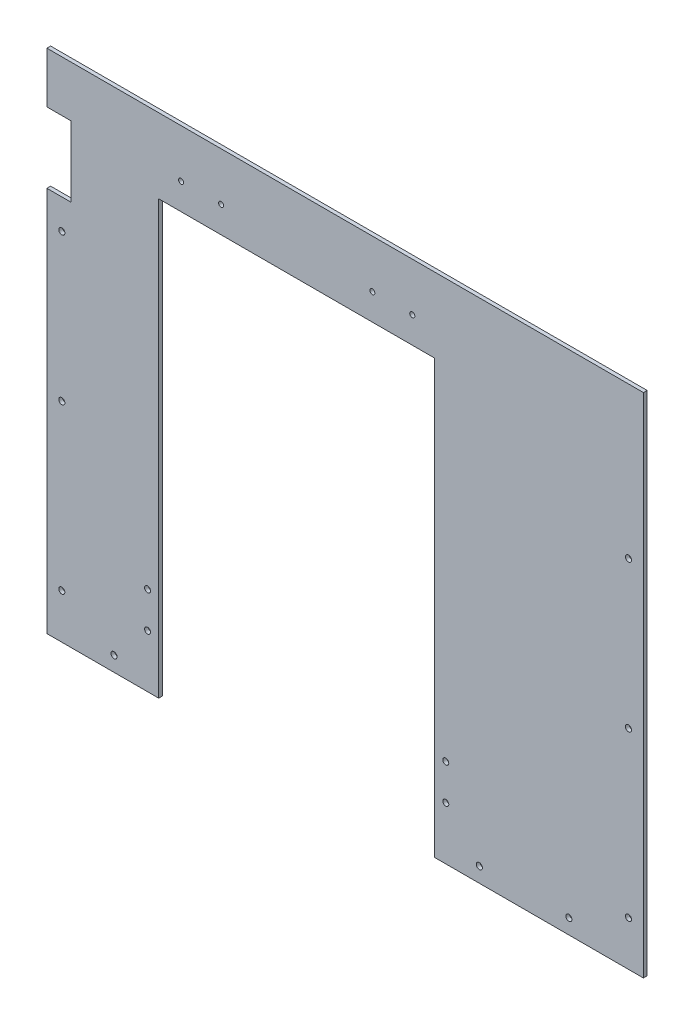
ISO-10303-21;
HEADER;
FILE_DESCRIPTION(('STEP AP214'),'2;1');
FILE_NAME('part.step','',(''),(''),'','','');
FILE_SCHEMA(('AUTOMOTIVE_DESIGN { 1 0 10303 214 1 1 1 1 }'));
ENDSEC;
DATA;
#1=APPLICATION_CONTEXT('core data for automotive mechanical design processes');
#2=APPLICATION_PROTOCOL_DEFINITION('international standard','automotive_design',2000,#1);
#3=PRODUCT_CONTEXT('',#1,'mechanical');
#4=PRODUCT('Part','Part','',(#3));
#5=PRODUCT_RELATED_PRODUCT_CATEGORY('part','',(#4));
#6=PRODUCT_DEFINITION_FORMATION('','',#4);
#7=PRODUCT_DEFINITION_CONTEXT('part definition',#1,'design');
#8=PRODUCT_DEFINITION('design','',#6,#7);
#9=PRODUCT_DEFINITION_SHAPE('','',#8);
#10=(LENGTH_UNIT() NAMED_UNIT(*) SI_UNIT(.MILLI.,.METRE.));
#11=(NAMED_UNIT(*) PLANE_ANGLE_UNIT() SI_UNIT($,.RADIAN.));
#12=(NAMED_UNIT(*) SI_UNIT($,.STERADIAN.) SOLID_ANGLE_UNIT());
#13=UNCERTAINTY_MEASURE_WITH_UNIT(LENGTH_MEASURE(1.E-05),#10,'distance_accuracy_value','');
#14=(GEOMETRIC_REPRESENTATION_CONTEXT(3) GLOBAL_UNCERTAINTY_ASSIGNED_CONTEXT((#13)) GLOBAL_UNIT_ASSIGNED_CONTEXT((#10,
#11,#12)) REPRESENTATION_CONTEXT('',''));
#15=CARTESIAN_POINT('',(0.,0.,0.));
#16=DIRECTION('',(0.,0.,1.));
#17=DIRECTION('',(1.,0.,0.));
#18=AXIS2_PLACEMENT_3D('',#15,#16,#17);
#19=CARTESIAN_POINT('',(0.,0.,3.175));
#20=DIRECTION('',(0.,1.,0.));
#21=DIRECTION('',(0.,0.,1.));
#22=AXIS2_PLACEMENT_3D('',#19,#20,#21);
#23=PLANE('',#22);
#24=DIRECTION('',(1.,0.,0.));
#25=VECTOR('',#24,1.);
#26=CARTESIAN_POINT('',(0.,0.,0.));
#27=LINE('',#26,#25);
#28=CARTESIAN_POINT('',(0.,0.,0.));
#29=VERTEX_POINT('',#28);
#30=CARTESIAN_POINT('',(95.2500000000001,-1.02649894704531E-13,0.));
#31=VERTEX_POINT('',#30);
#32=EDGE_CURVE('E158',#29,#31,#27,.T.);
#33=ORIENTED_EDGE('',*,*,#32,.T.);
#34=DIRECTION('',(0.,0.,-1.));
#35=VECTOR('',#34,1.);
#36=CARTESIAN_POINT('',(95.2500000000001,-1.02649894704531E-13,44.45));
#37=LINE('',#36,#35);
#38=CARTESIAN_POINT('',(95.2500000000001,-1.02649894704531E-13,3.175));
#39=VERTEX_POINT('',#38);
#40=EDGE_CURVE('E246',#39,#31,#37,.T.);
#41=ORIENTED_EDGE('',*,*,#40,.F.);
#42=DIRECTION('',(1.,0.,0.));
#43=VECTOR('',#42,1.);
#44=CARTESIAN_POINT('',(0.,0.,3.175));
#45=LINE('',#44,#43);
#46=CARTESIAN_POINT('',(0.,0.,3.175));
#47=VERTEX_POINT('',#46);
#48=EDGE_CURVE('E171',#47,#39,#45,.T.);
#49=ORIENTED_EDGE('',*,*,#48,.F.);
#50=DIRECTION('',(0.,0.,-1.));
#51=VECTOR('',#50,1.);
#52=CARTESIAN_POINT('',(0.,0.,3.175));
#53=LINE('',#52,#51);
#54=EDGE_CURVE('E11',#47,#29,#53,.T.);
#55=ORIENTED_EDGE('',*,*,#54,.T.);
#56=EDGE_LOOP('',(#33,#41,#49,#55));
#57=FACE_BOUND('',#56,.T.);
#58=ADVANCED_FACE('F42',(#57),#23,.F.);
#59=CARTESIAN_POINT('',(0.,0.,3.175));
#60=DIRECTION('',(1.,0.,0.));
#61=DIRECTION('',(0.,0.,-1.));
#62=AXIS2_PLACEMENT_3D('',#59,#60,#61);
#63=PLANE('',#62);
#64=DIRECTION('',(0.,-1.,0.));
#65=VECTOR('',#64,1.);
#66=CARTESIAN_POINT('',(0.,0.,3.175));
#67=LINE('',#66,#65);
#68=CARTESIAN_POINT('',(0.,328.45375,3.175));
#69=VERTEX_POINT('',#68);
#70=EDGE_CURVE('E157',#69,#47,#67,.T.);
#71=ORIENTED_EDGE('',*,*,#70,.F.);
#72=DIRECTION('',(0.,0.,-1.));
#73=VECTOR('',#72,1.);
#74=CARTESIAN_POINT('',(0.,328.45375,44.45));
#75=LINE('',#74,#73);
#76=CARTESIAN_POINT('',(0.,328.45375,0.));
#77=VERTEX_POINT('',#76);
#78=EDGE_CURVE('E230',#69,#77,#75,.T.);
#79=ORIENTED_EDGE('',*,*,#78,.T.);
#80=DIRECTION('',(0.,-1.,0.));
#81=VECTOR('',#80,1.);
#82=CARTESIAN_POINT('',(0.,0.,0.));
#83=LINE('',#82,#81);
#84=EDGE_CURVE('E177',#77,#29,#83,.T.);
#85=ORIENTED_EDGE('',*,*,#84,.T.);
#86=ORIENTED_EDGE('',*,*,#54,.F.);
#87=EDGE_LOOP('',(#71,#79,#85,#86));
#88=FACE_BOUND('',#87,.T.);
#89=ADVANCED_FACE('F44',(#88),#63,.F.);
#90=CARTESIAN_POINT('',(330.2,-1.60196047796465E-13,3.175));
#91=VERTEX_POINT('',#90);
#92=CARTESIAN_POINT('',(508.,0.,3.175));
#93=VERTEX_POINT('',#92);
#94=EDGE_CURVE('E162',#91,#93,#45,.T.);
#95=ORIENTED_EDGE('',*,*,#94,.F.);
#96=DIRECTION('',(0.,0.,-1.));
#97=VECTOR('',#96,1.);
#98=CARTESIAN_POINT('',(330.2,-1.60196047796465E-13,44.45));
#99=LINE('',#98,#97);
#100=CARTESIAN_POINT('',(330.2,-1.60196047796465E-13,0.));
#101=VERTEX_POINT('',#100);
#102=EDGE_CURVE('E242',#91,#101,#99,.T.);
#103=ORIENTED_EDGE('',*,*,#102,.T.);
#104=CARTESIAN_POINT('',(508.,0.,0.));
#105=VERTEX_POINT('',#104);
#106=EDGE_CURVE('E165',#101,#105,#27,.T.);
#107=ORIENTED_EDGE('',*,*,#106,.T.);
#108=DIRECTION('',(0.,0.,-1.));
#109=VECTOR('',#108,1.);
#110=CARTESIAN_POINT('',(508.,0.,3.175));
#111=LINE('',#110,#109);
#112=EDGE_CURVE('E51',#93,#105,#111,.T.);
#113=ORIENTED_EDGE('',*,*,#112,.F.);
#114=EDGE_LOOP('',(#95,#103,#107,#113));
#115=FACE_BOUND('',#114,.T.);
#116=ADVANCED_FACE('F421',(#115),#23,.F.);
#117=CARTESIAN_POINT('',(508.,0.,3.175));
#118=DIRECTION('',(-1.,0.,0.));
#119=DIRECTION('',(0.,0.,1.));
#120=AXIS2_PLACEMENT_3D('',#117,#118,#119);
#121=PLANE('',#120);
#122=DIRECTION('',(0.,1.,0.));
#123=VECTOR('',#122,1.);
#124=CARTESIAN_POINT('',(508.,0.,0.));
#125=LINE('',#124,#123);
#126=CARTESIAN_POINT('',(508.,431.8,0.));
#127=VERTEX_POINT('',#126);
#128=EDGE_CURVE('E149',#105,#127,#125,.T.);
#129=ORIENTED_EDGE('',*,*,#128,.T.);
#130=DIRECTION('',(0.,0.,1.));
#131=VECTOR('',#130,1.);
#132=CARTESIAN_POINT('',(508.,431.8,0.));
#133=LINE('',#132,#131);
#134=CARTESIAN_POINT('',(508.,431.8,3.175));
#135=VERTEX_POINT('',#134);
#136=EDGE_CURVE('E131',#127,#135,#133,.T.);
#137=ORIENTED_EDGE('',*,*,#136,.T.);
#138=DIRECTION('',(0.,1.,0.));
#139=VECTOR('',#138,1.);
#140=CARTESIAN_POINT('',(508.,0.,3.175));
#141=LINE('',#140,#139);
#142=EDGE_CURVE('E169',#93,#135,#141,.T.);
#143=ORIENTED_EDGE('',*,*,#142,.F.);
#144=ORIENTED_EDGE('',*,*,#112,.T.);
#145=EDGE_LOOP('',(#129,#137,#143,#144));
#146=FACE_BOUND('',#145,.T.);
#147=ADVANCED_FACE('F154',(#146),#121,.F.);
#148=CARTESIAN_POINT('',(0.,0.,3.175));
#149=DIRECTION('',(0.,0.,-1.));
#150=DIRECTION('',(-1.,0.,0.));
#151=AXIS2_PLACEMENT_3D('',#148,#149,#150);
#152=PLANE('',#151);
#153=CARTESIAN_POINT('',(368.3,12.7,3.175));
#154=DIRECTION('',(0.,0.,1.));
#155=DIRECTION('',(1.,0.,0.));
#156=AXIS2_PLACEMENT_3D('',#153,#154,#155);
#157=CIRCLE('',#156,2.60000000000002);
#158=CARTESIAN_POINT('',(370.9,12.7,3.175));
#159=VERTEX_POINT('',#158);
#160=EDGE_CURVE('E351',#159,#159,#157,.T.);
#161=ORIENTED_EDGE('',*,*,#160,.F.);
#162=EDGE_LOOP('',(#161));
#163=FACE_BOUND('',#162,.T.);
#164=CARTESIAN_POINT('',(57.15,12.6999999999999,3.175));
#165=DIRECTION('',(0.,0.,1.));
#166=DIRECTION('',(1.,0.,0.));
#167=AXIS2_PLACEMENT_3D('',#164,#165,#166);
#168=CIRCLE('',#167,2.6);
#169=CARTESIAN_POINT('',(59.75,12.6999999999999,3.175));
#170=VERTEX_POINT('',#169);
#171=EDGE_CURVE('E360',#170,#170,#168,.T.);
#172=ORIENTED_EDGE('',*,*,#171,.F.);
#173=EDGE_LOOP('',(#172));
#174=FACE_BOUND('',#173,.T.);
#175=CARTESIAN_POINT('',(495.3,303.05375,3.175));
#176=DIRECTION('',(0.,0.,1.));
#177=DIRECTION('',(1.,0.,0.));
#178=AXIS2_PLACEMENT_3D('',#175,#176,#177);
#179=CIRCLE('',#178,2.60000000000001);
#180=CARTESIAN_POINT('',(497.9,303.05375,3.175));
#181=VERTEX_POINT('',#180);
#182=EDGE_CURVE('E320',#181,#181,#179,.T.);
#183=ORIENTED_EDGE('',*,*,#182,.F.);
#184=EDGE_LOOP('',(#183));
#185=FACE_BOUND('',#184,.T.);
#186=CARTESIAN_POINT('',(495.3,177.8,3.175));
#187=DIRECTION('',(0.,0.,1.));
#188=DIRECTION('',(1.,0.,0.));
#189=AXIS2_PLACEMENT_3D('',#186,#187,#188);
#190=CIRCLE('',#189,2.60000000000001);
#191=CARTESIAN_POINT('',(497.9,177.8,3.175));
#192=VERTEX_POINT('',#191);
#193=EDGE_CURVE('E319',#192,#192,#190,.T.);
#194=ORIENTED_EDGE('',*,*,#193,.F.);
#195=EDGE_LOOP('',(#194));
#196=FACE_BOUND('',#195,.T.);
#197=CARTESIAN_POINT('',(495.3,38.0999999999999,3.175));
#198=DIRECTION('',(0.,0.,1.));
#199=DIRECTION('',(1.,0.,0.));
#200=AXIS2_PLACEMENT_3D('',#197,#198,#199);
#201=CIRCLE('',#200,2.60000000000002);
#202=CARTESIAN_POINT('',(497.9,38.0999999999999,3.175));
#203=VERTEX_POINT('',#202);
#204=EDGE_CURVE('E328',#203,#203,#201,.T.);
#205=ORIENTED_EDGE('',*,*,#204,.F.);
#206=EDGE_LOOP('',(#205));
#207=FACE_BOUND('',#206,.T.);
#208=CARTESIAN_POINT('',(12.7,38.1,3.175));
#209=DIRECTION('',(0.,0.,1.));
#210=DIRECTION('',(1.,0.,0.));
#211=AXIS2_PLACEMENT_3D('',#208,#209,#210);
#212=CIRCLE('',#211,2.59999999999999);
#213=CARTESIAN_POINT('',(15.3,38.1,3.175));
#214=VERTEX_POINT('',#213);
#215=EDGE_CURVE('E336',#214,#214,#212,.T.);
#216=ORIENTED_EDGE('',*,*,#215,.F.);
#217=EDGE_LOOP('',(#216));
#218=FACE_BOUND('',#217,.T.);
#219=CARTESIAN_POINT('',(12.7,177.8,3.175));
#220=DIRECTION('',(0.,0.,1.));
#221=DIRECTION('',(1.,0.,0.));
#222=AXIS2_PLACEMENT_3D('',#219,#220,#221);
#223=CIRCLE('',#222,2.59999999999999);
#224=CARTESIAN_POINT('',(15.3,177.8,3.175));
#225=VERTEX_POINT('',#224);
#226=EDGE_CURVE('E311',#225,#225,#223,.T.);
#227=ORIENTED_EDGE('',*,*,#226,.F.);
#228=EDGE_LOOP('',(#227));
#229=FACE_BOUND('',#228,.T.);
#230=CARTESIAN_POINT('',(444.5,12.7,3.175));
#231=DIRECTION('',(0.,0.,1.));
#232=DIRECTION('',(1.,0.,0.));
#233=AXIS2_PLACEMENT_3D('',#230,#231,#232);
#234=CIRCLE('',#233,2.60000000000002);
#235=CARTESIAN_POINT('',(447.1,12.7,3.175));
#236=VERTEX_POINT('',#235);
#237=EDGE_CURVE('E352',#236,#236,#234,.T.);
#238=ORIENTED_EDGE('',*,*,#237,.F.);
#239=EDGE_LOOP('',(#238));
#240=FACE_BOUND('',#239,.T.);
#241=CARTESIAN_POINT('',(12.7,303.05375,3.175));
#242=DIRECTION('',(0.,0.,1.));
#243=DIRECTION('',(1.,0.,0.));
#244=AXIS2_PLACEMENT_3D('',#241,#242,#243);
#245=CIRCLE('',#244,2.6);
#246=CARTESIAN_POINT('',(15.2999999999999,303.05375,3.175));
#247=VERTEX_POINT('',#246);
#248=EDGE_CURVE('E307',#247,#247,#245,.T.);
#249=ORIENTED_EDGE('',*,*,#248,.F.);
#250=EDGE_LOOP('',(#249));
#251=FACE_BOUND('',#250,.T.);
#252=CARTESIAN_POINT('',(311.1754,390.779,3.175));
#253=DIRECTION('',(0.,0.,-1.));
#254=DIRECTION('',(-1.,0.,0.));
#255=AXIS2_PLACEMENT_3D('',#252,#253,#254);
#256=CIRCLE('',#255,2.15900000000003);
#257=CARTESIAN_POINT('',(309.0164,390.779,3.175));
#258=VERTEX_POINT('',#257);
#259=EDGE_CURVE('E274',#258,#258,#256,.T.);
#260=ORIENTED_EDGE('',*,*,#259,.T.);
#261=EDGE_LOOP('',(#260));
#262=FACE_BOUND('',#261,.T.);
#263=CARTESIAN_POINT('',(277.1394,390.779,3.175));
#264=DIRECTION('',(0.,0.,-1.));
#265=DIRECTION('',(-1.,0.,0.));
#266=AXIS2_PLACEMENT_3D('',#263,#264,#265);
#267=CIRCLE('',#266,2.15900000000003);
#268=CARTESIAN_POINT('',(274.9804,390.779,3.175));
#269=VERTEX_POINT('',#268);
#270=EDGE_CURVE('E292',#269,#269,#267,.T.);
#271=ORIENTED_EDGE('',*,*,#270,.T.);
#272=EDGE_LOOP('',(#271));
#273=FACE_BOUND('',#272,.T.);
#274=CARTESIAN_POINT('',(148.3614,390.779,3.175));
#275=DIRECTION('',(0.,0.,-1.));
#276=DIRECTION('',(-1.,0.,0.));
#277=AXIS2_PLACEMENT_3D('',#274,#275,#276);
#278=CIRCLE('',#277,2.159);
#279=CARTESIAN_POINT('',(146.2024,390.779,3.175));
#280=VERTEX_POINT('',#279);
#281=EDGE_CURVE('E284',#280,#280,#278,.T.);
#282=ORIENTED_EDGE('',*,*,#281,.T.);
#283=EDGE_LOOP('',(#282));
#284=FACE_BOUND('',#283,.T.);
#285=CARTESIAN_POINT('',(114.3254,390.779,3.175));
#286=DIRECTION('',(0.,0.,-1.));
#287=DIRECTION('',(-1.,0.,0.));
#288=AXIS2_PLACEMENT_3D('',#285,#286,#287);
#289=CIRCLE('',#288,2.159);
#290=CARTESIAN_POINT('',(112.1664,390.779,3.175));
#291=VERTEX_POINT('',#290);
#292=EDGE_CURVE('E275',#291,#291,#289,.T.);
#293=ORIENTED_EDGE('',*,*,#292,.T.);
#294=EDGE_LOOP('',(#293));
#295=FACE_BOUND('',#294,.T.);
#296=ORIENTED_EDGE('',*,*,#142,.T.);
#297=DIRECTION('',(1.,0.,0.));
#298=VECTOR('',#297,1.);
#299=CARTESIAN_POINT('',(0.,431.8,3.175));
#300=LINE('',#299,#298);
#301=CARTESIAN_POINT('',(0.,431.8,3.175));
#302=VERTEX_POINT('',#301);
#303=EDGE_CURVE('E134',#302,#135,#300,.T.);
#304=ORIENTED_EDGE('',*,*,#303,.F.);
#305=DIRECTION('',(0.,-1.,0.));
#306=VECTOR('',#305,1.);
#307=CARTESIAN_POINT('',(0.,388.453750000003,3.175));
#308=LINE('',#307,#306);
#309=CARTESIAN_POINT('',(0.,388.453750000003,3.175));
#310=VERTEX_POINT('',#309);
#311=EDGE_CURVE('E140',#302,#310,#308,.T.);
#312=ORIENTED_EDGE('',*,*,#311,.T.);
#313=DIRECTION('',(1.,0.,0.));
#314=VECTOR('',#313,1.);
#315=CARTESIAN_POINT('',(20.6374999999986,388.453750000003,3.175));
#316=LINE('',#315,#314);
#317=CARTESIAN_POINT('',(20.6374999999986,388.453750000003,3.175));
#318=VERTEX_POINT('',#317);
#319=EDGE_CURVE('E387',#310,#318,#316,.T.);
#320=ORIENTED_EDGE('',*,*,#319,.T.);
#321=DIRECTION('',(0.,-1.,0.));
#322=VECTOR('',#321,1.);
#323=CARTESIAN_POINT('',(20.6375,0.,3.175));
#324=LINE('',#323,#322);
#325=CARTESIAN_POINT('',(20.6374999999999,328.45375,3.175));
#326=VERTEX_POINT('',#325);
#327=EDGE_CURVE('E202',#318,#326,#324,.T.);
#328=ORIENTED_EDGE('',*,*,#327,.T.);
#329=DIRECTION('',(-1.,0.,0.));
#330=VECTOR('',#329,1.);
#331=CARTESIAN_POINT('',(0.,328.45375,3.175));
#332=LINE('',#331,#330);
#333=EDGE_CURVE('E198',#326,#69,#332,.T.);
#334=ORIENTED_EDGE('',*,*,#333,.T.);
#335=ORIENTED_EDGE('',*,*,#70,.T.);
#336=ORIENTED_EDGE('',*,*,#48,.T.);
#337=DIRECTION('',(0.,1.,0.));
#338=VECTOR('',#337,1.);
#339=CARTESIAN_POINT('',(95.2500000000001,0.,3.175));
#340=LINE('',#339,#338);
#341=CARTESIAN_POINT('',(95.2500000000001,368.3,3.175));
#342=VERTEX_POINT('',#341);
#343=EDGE_CURVE('E179',#39,#342,#340,.T.);
#344=ORIENTED_EDGE('',*,*,#343,.T.);
#345=DIRECTION('',(1.,0.,0.));
#346=VECTOR('',#345,1.);
#347=CARTESIAN_POINT('',(0.,368.3,3.175));
#348=LINE('',#347,#346);
#349=CARTESIAN_POINT('',(330.2,368.3,3.175));
#350=VERTEX_POINT('',#349);
#351=EDGE_CURVE('E193',#342,#350,#348,.T.);
#352=ORIENTED_EDGE('',*,*,#351,.T.);
#353=DIRECTION('',(0.,-1.,0.));
#354=VECTOR('',#353,1.);
#355=CARTESIAN_POINT('',(330.2,0.,3.175));
#356=LINE('',#355,#354);
#357=EDGE_CURVE('E188',#350,#91,#356,.T.);
#358=ORIENTED_EDGE('',*,*,#357,.T.);
#359=ORIENTED_EDGE('',*,*,#94,.T.);
#360=EDGE_LOOP('',(#296,#304,#312,#320,#328,#334,#335,#336,#344,#352,#358,#359));
#361=FACE_BOUND('',#360,.T.);
#362=CARTESIAN_POINT('',(339.725,75.565,3.175));
#363=DIRECTION('',(0.,0.,-1.));
#364=DIRECTION('',(-1.,0.,0.));
#365=AXIS2_PLACEMENT_3D('',#362,#363,#364);
#366=CIRCLE('',#365,2.54000000000001);
#367=CARTESIAN_POINT('',(337.185,75.565,3.175));
#368=VERTEX_POINT('',#367);
#369=EDGE_CURVE('E205',#368,#368,#366,.T.);
#370=ORIENTED_EDGE('',*,*,#369,.T.);
#371=EDGE_LOOP('',(#370));
#372=FACE_BOUND('',#371,.T.);
#373=CARTESIAN_POINT('',(85.7250000000001,45.085,3.175));
#374=DIRECTION('',(0.,0.,-1.));
#375=DIRECTION('',(-1.,0.,0.));
#376=AXIS2_PLACEMENT_3D('',#373,#374,#375);
#377=CIRCLE('',#376,2.53999999999998);
#378=CARTESIAN_POINT('',(83.1850000000001,45.085,3.175));
#379=VERTEX_POINT('',#378);
#380=EDGE_CURVE('E209',#379,#379,#377,.T.);
#381=ORIENTED_EDGE('',*,*,#380,.T.);
#382=EDGE_LOOP('',(#381));
#383=FACE_BOUND('',#382,.T.);
#384=CARTESIAN_POINT('',(85.725,75.565,3.175));
#385=DIRECTION('',(0.,0.,-1.));
#386=DIRECTION('',(-1.,0.,0.));
#387=AXIS2_PLACEMENT_3D('',#384,#385,#386);
#388=CIRCLE('',#387,2.54000000000001);
#389=CARTESIAN_POINT('',(83.185,75.565,3.175));
#390=VERTEX_POINT('',#389);
#391=EDGE_CURVE('E213',#390,#390,#388,.T.);
#392=ORIENTED_EDGE('',*,*,#391,.T.);
#393=EDGE_LOOP('',(#392));
#394=FACE_BOUND('',#393,.T.);
#395=CARTESIAN_POINT('',(339.725,45.085,3.175));
#396=DIRECTION('',(0.,0.,-1.));
#397=DIRECTION('',(-1.,0.,0.));
#398=AXIS2_PLACEMENT_3D('',#395,#396,#397);
#399=CIRCLE('',#398,2.54000000000001);
#400=CARTESIAN_POINT('',(337.185,45.085,3.175));
#401=VERTEX_POINT('',#400);
#402=EDGE_CURVE('E217',#401,#401,#399,.T.);
#403=ORIENTED_EDGE('',*,*,#402,.T.);
#404=EDGE_LOOP('',(#403));
#405=FACE_BOUND('',#404,.T.);
#406=ADVANCED_FACE('F400',(#163,#174,#185,#196,#207,#218,#229,#240,#251,#262,#273,#284,#295,
#361,#372,#383,#394,#405),#152,.F.);
#407=CARTESIAN_POINT('',(0.,0.,0.));
#408=DIRECTION('',(0.,0.,-1.));
#409=DIRECTION('',(-1.,0.,0.));
#410=AXIS2_PLACEMENT_3D('',#407,#408,#409);
#411=PLANE('',#410);
#412=DIRECTION('',(1.,0.,0.));
#413=VECTOR('',#412,1.);
#414=CARTESIAN_POINT('',(0.,431.8,0.));
#415=LINE('',#414,#413);
#416=CARTESIAN_POINT('',(0.,431.8,0.));
#417=VERTEX_POINT('',#416);
#418=EDGE_CURVE('E58',#417,#127,#415,.T.);
#419=ORIENTED_EDGE('',*,*,#418,.T.);
#420=ORIENTED_EDGE('',*,*,#128,.F.);
#421=ORIENTED_EDGE('',*,*,#106,.F.);
#422=DIRECTION('',(0.,-1.,0.));
#423=VECTOR('',#422,1.);
#424=CARTESIAN_POINT('',(330.2,-1.60196047796465E-13,0.));
#425=LINE('',#424,#423);
#426=CARTESIAN_POINT('',(330.2,368.3,0.));
#427=VERTEX_POINT('',#426);
#428=EDGE_CURVE('E239',#427,#101,#425,.T.);
#429=ORIENTED_EDGE('',*,*,#428,.F.);
#430=DIRECTION('',(1.,0.,0.));
#431=VECTOR('',#430,1.);
#432=CARTESIAN_POINT('',(95.2500000000001,368.3,0.));
#433=LINE('',#432,#431);
#434=CARTESIAN_POINT('',(95.2500000000001,368.3,0.));
#435=VERTEX_POINT('',#434);
#436=EDGE_CURVE('E252',#435,#427,#433,.T.);
#437=ORIENTED_EDGE('',*,*,#436,.F.);
#438=DIRECTION('',(0.,1.,0.));
#439=VECTOR('',#438,1.);
#440=CARTESIAN_POINT('',(95.2500000000001,-1.02649894704531E-13,0.));
#441=LINE('',#440,#439);
#442=EDGE_CURVE('E256',#31,#435,#441,.T.);
#443=ORIENTED_EDGE('',*,*,#442,.F.);
#444=ORIENTED_EDGE('',*,*,#32,.F.);
#445=ORIENTED_EDGE('',*,*,#84,.F.);
#446=DIRECTION('',(-1.,0.,0.));
#447=VECTOR('',#446,1.);
#448=CARTESIAN_POINT('',(0.,328.45375,0.));
#449=LINE('',#448,#447);
#450=CARTESIAN_POINT('',(20.6374999999999,328.45375,0.));
#451=VERTEX_POINT('',#450);
#452=EDGE_CURVE('E264',#451,#77,#449,.T.);
#453=ORIENTED_EDGE('',*,*,#452,.F.);
#454=DIRECTION('',(0.,-1.,0.));
#455=VECTOR('',#454,1.);
#456=CARTESIAN_POINT('',(20.6374999999999,403.06625,0.));
#457=LINE('',#456,#455);
#458=CARTESIAN_POINT('',(20.6374999999999,388.453750000003,0.));
#459=VERTEX_POINT('',#458);
#460=EDGE_CURVE('E249',#459,#451,#457,.T.);
#461=ORIENTED_EDGE('',*,*,#460,.F.);
#462=DIRECTION('',(1.,0.,0.));
#463=VECTOR('',#462,1.);
#464=CARTESIAN_POINT('',(20.6374999999986,388.453750000003,0.));
#465=LINE('',#464,#463);
#466=CARTESIAN_POINT('',(0.,388.453750000003,0.));
#467=VERTEX_POINT('',#466);
#468=EDGE_CURVE('E66',#467,#459,#465,.T.);
#469=ORIENTED_EDGE('',*,*,#468,.F.);
#470=DIRECTION('',(0.,-1.,0.));
#471=VECTOR('',#470,1.);
#472=CARTESIAN_POINT('',(0.,388.453750000003,0.));
#473=LINE('',#472,#471);
#474=EDGE_CURVE('E150',#417,#467,#473,.T.);
#475=ORIENTED_EDGE('',*,*,#474,.F.);
#476=EDGE_LOOP('',(#419,#420,#421,#429,#437,#443,#444,#445,#453,#461,#469,#475));
#477=FACE_BOUND('',#476,.T.);
#478=CARTESIAN_POINT('',(368.3,12.7,0.));
#479=DIRECTION('',(0.,0.,1.));
#480=DIRECTION('',(1.,0.,0.));
#481=AXIS2_PLACEMENT_3D('',#478,#479,#480);
#482=CIRCLE('',#481,2.60000000000002);
#483=CARTESIAN_POINT('',(370.9,12.7,0.));
#484=VERTEX_POINT('',#483);
#485=EDGE_CURVE('E347',#484,#484,#482,.T.);
#486=ORIENTED_EDGE('',*,*,#485,.T.);
#487=EDGE_LOOP('',(#486));
#488=FACE_BOUND('',#487,.T.);
#489=CARTESIAN_POINT('',(57.15,12.6999999999999,0.));
#490=DIRECTION('',(0.,0.,1.));
#491=DIRECTION('',(1.,0.,0.));
#492=AXIS2_PLACEMENT_3D('',#489,#490,#491);
#493=CIRCLE('',#492,2.6);
#494=CARTESIAN_POINT('',(59.75,12.6999999999999,0.));
#495=VERTEX_POINT('',#494);
#496=EDGE_CURVE('E356',#495,#495,#493,.T.);
#497=ORIENTED_EDGE('',*,*,#496,.T.);
#498=EDGE_LOOP('',(#497));
#499=FACE_BOUND('',#498,.T.);
#500=CARTESIAN_POINT('',(495.3,303.05375,0.));
#501=DIRECTION('',(0.,0.,1.));
#502=DIRECTION('',(1.,0.,0.));
#503=AXIS2_PLACEMENT_3D('',#500,#501,#502);
#504=CIRCLE('',#503,2.60000000000001);
#505=CARTESIAN_POINT('',(497.9,303.05375,0.));
#506=VERTEX_POINT('',#505);
#507=EDGE_CURVE('E364',#506,#506,#504,.T.);
#508=ORIENTED_EDGE('',*,*,#507,.T.);
#509=EDGE_LOOP('',(#508));
#510=FACE_BOUND('',#509,.T.);
#511=CARTESIAN_POINT('',(495.3,177.8,0.));
#512=DIRECTION('',(0.,0.,1.));
#513=DIRECTION('',(1.,0.,0.));
#514=AXIS2_PLACEMENT_3D('',#511,#512,#513);
#515=CIRCLE('',#514,2.60000000000001);
#516=CARTESIAN_POINT('',(497.9,177.8,0.));
#517=VERTEX_POINT('',#516);
#518=EDGE_CURVE('E315',#517,#517,#515,.T.);
#519=ORIENTED_EDGE('',*,*,#518,.T.);
#520=EDGE_LOOP('',(#519));
#521=FACE_BOUND('',#520,.T.);
#522=CARTESIAN_POINT('',(495.3,38.0999999999999,0.));
#523=DIRECTION('',(0.,0.,1.));
#524=DIRECTION('',(1.,0.,0.));
#525=AXIS2_PLACEMENT_3D('',#522,#523,#524);
#526=CIRCLE('',#525,2.60000000000002);
#527=CARTESIAN_POINT('',(497.9,38.0999999999999,0.));
#528=VERTEX_POINT('',#527);
#529=EDGE_CURVE('E324',#528,#528,#526,.T.);
#530=ORIENTED_EDGE('',*,*,#529,.T.);
#531=EDGE_LOOP('',(#530));
#532=FACE_BOUND('',#531,.T.);
#533=CARTESIAN_POINT('',(12.7,38.1,0.));
#534=DIRECTION('',(0.,0.,1.));
#535=DIRECTION('',(1.,0.,0.));
#536=AXIS2_PLACEMENT_3D('',#533,#534,#535);
#537=CIRCLE('',#536,2.59999999999999);
#538=CARTESIAN_POINT('',(15.3,38.1,0.));
#539=VERTEX_POINT('',#538);
#540=EDGE_CURVE('E332',#539,#539,#537,.T.);
#541=ORIENTED_EDGE('',*,*,#540,.T.);
#542=EDGE_LOOP('',(#541));
#543=FACE_BOUND('',#542,.T.);
#544=CARTESIAN_POINT('',(12.7,177.8,0.));
#545=DIRECTION('',(0.,0.,1.));
#546=DIRECTION('',(1.,0.,0.));
#547=AXIS2_PLACEMENT_3D('',#544,#545,#546);
#548=CIRCLE('',#547,2.59999999999999);
#549=CARTESIAN_POINT('',(15.3,177.8,0.));
#550=VERTEX_POINT('',#549);
#551=EDGE_CURVE('E340',#550,#550,#548,.T.);
#552=ORIENTED_EDGE('',*,*,#551,.T.);
#553=EDGE_LOOP('',(#552));
#554=FACE_BOUND('',#553,.T.);
#555=CARTESIAN_POINT('',(444.5,12.7,0.));
#556=DIRECTION('',(0.,0.,1.));
#557=DIRECTION('',(1.,0.,0.));
#558=AXIS2_PLACEMENT_3D('',#555,#556,#557);
#559=CIRCLE('',#558,2.60000000000002);
#560=CARTESIAN_POINT('',(447.1,12.7,0.));
#561=VERTEX_POINT('',#560);
#562=EDGE_CURVE('E371',#561,#561,#559,.T.);
#563=ORIENTED_EDGE('',*,*,#562,.T.);
#564=EDGE_LOOP('',(#563));
#565=FACE_BOUND('',#564,.T.);
#566=CARTESIAN_POINT('',(12.7,303.05375,0.));
#567=DIRECTION('',(0.,0.,1.));
#568=DIRECTION('',(1.,0.,0.));
#569=AXIS2_PLACEMENT_3D('',#566,#567,#568);
#570=CIRCLE('',#569,2.6);
#571=CARTESIAN_POINT('',(15.2999999999999,303.05375,0.));
#572=VERTEX_POINT('',#571);
#573=EDGE_CURVE('E280',#572,#572,#570,.T.);
#574=ORIENTED_EDGE('',*,*,#573,.T.);
#575=EDGE_LOOP('',(#574));
#576=FACE_BOUND('',#575,.T.);
#577=CARTESIAN_POINT('',(311.1754,390.779,0.));
#578=DIRECTION('',(0.,0.,-1.));
#579=DIRECTION('',(-1.,0.,0.));
#580=AXIS2_PLACEMENT_3D('',#577,#578,#579);
#581=CIRCLE('',#580,2.15900000000003);
#582=CARTESIAN_POINT('',(309.0164,390.779,0.));
#583=VERTEX_POINT('',#582);
#584=EDGE_CURVE('E300',#583,#583,#581,.T.);
#585=ORIENTED_EDGE('',*,*,#584,.F.);
#586=EDGE_LOOP('',(#585));
#587=FACE_BOUND('',#586,.T.);
#588=CARTESIAN_POINT('',(277.1394,390.779,0.));
#589=DIRECTION('',(0.,0.,-1.));
#590=DIRECTION('',(-1.,0.,0.));
#591=AXIS2_PLACEMENT_3D('',#588,#589,#590);
#592=CIRCLE('',#591,2.15900000000003);
#593=CARTESIAN_POINT('',(274.9804,390.779,0.));
#594=VERTEX_POINT('',#593);
#595=EDGE_CURVE('E296',#594,#594,#592,.T.);
#596=ORIENTED_EDGE('',*,*,#595,.F.);
#597=EDGE_LOOP('',(#596));
#598=FACE_BOUND('',#597,.T.);
#599=CARTESIAN_POINT('',(148.3614,390.779,0.));
#600=DIRECTION('',(0.,0.,-1.));
#601=DIRECTION('',(-1.,0.,0.));
#602=AXIS2_PLACEMENT_3D('',#599,#600,#601);
#603=CIRCLE('',#602,2.159);
#604=CARTESIAN_POINT('',(146.2024,390.779,0.));
#605=VERTEX_POINT('',#604);
#606=EDGE_CURVE('E288',#605,#605,#603,.T.);
#607=ORIENTED_EDGE('',*,*,#606,.F.);
#608=EDGE_LOOP('',(#607));
#609=FACE_BOUND('',#608,.T.);
#610=CARTESIAN_POINT('',(114.3254,390.779,0.));
#611=DIRECTION('',(0.,0.,-1.));
#612=DIRECTION('',(-1.,0.,0.));
#613=AXIS2_PLACEMENT_3D('',#610,#611,#612);
#614=CIRCLE('',#613,2.159);
#615=CARTESIAN_POINT('',(112.1664,390.779,0.));
#616=VERTEX_POINT('',#615);
#617=EDGE_CURVE('E279',#616,#616,#614,.T.);
#618=ORIENTED_EDGE('',*,*,#617,.F.);
#619=EDGE_LOOP('',(#618));
#620=FACE_BOUND('',#619,.T.);
#621=CARTESIAN_POINT('',(339.725,75.565,0.));
#622=DIRECTION('',(0.,0.,-1.));
#623=DIRECTION('',(-1.,0.,0.));
#624=AXIS2_PLACEMENT_3D('',#621,#622,#623);
#625=CIRCLE('',#624,2.54000000000001);
#626=CARTESIAN_POINT('',(337.185,75.565,0.));
#627=VERTEX_POINT('',#626);
#628=EDGE_CURVE('E226',#627,#627,#625,.T.);
#629=ORIENTED_EDGE('',*,*,#628,.F.);
#630=EDGE_LOOP('',(#629));
#631=FACE_BOUND('',#630,.T.);
#632=CARTESIAN_POINT('',(85.7250000000001,45.085,0.));
#633=DIRECTION('',(0.,0.,-1.));
#634=DIRECTION('',(-1.,0.,0.));
#635=AXIS2_PLACEMENT_3D('',#632,#633,#634);
#636=CIRCLE('',#635,2.53999999999998);
#637=CARTESIAN_POINT('',(83.1850000000001,45.085,0.));
#638=VERTEX_POINT('',#637);
#639=EDGE_CURVE('E225',#638,#638,#636,.T.);
#640=ORIENTED_EDGE('',*,*,#639,.F.);
#641=EDGE_LOOP('',(#640));
#642=FACE_BOUND('',#641,.T.);
#643=CARTESIAN_POINT('',(85.725,75.565,0.));
#644=DIRECTION('',(0.,0.,-1.));
#645=DIRECTION('',(1.,0.,0.));
#646=AXIS2_PLACEMENT_3D('',#643,#644,#645);
#647=CIRCLE('',#646,2.54000000000001);
#648=CARTESIAN_POINT('',(88.265,75.565,0.));
#649=VERTEX_POINT('',#648);
#650=EDGE_CURVE('E259',#649,#649,#647,.T.);
#651=ORIENTED_EDGE('',*,*,#650,.F.);
#652=EDGE_LOOP('',(#651));
#653=FACE_BOUND('',#652,.T.);
#654=CARTESIAN_POINT('',(339.725,45.085,0.));
#655=DIRECTION('',(0.,0.,-1.));
#656=DIRECTION('',(-1.,0.,0.));
#657=AXIS2_PLACEMENT_3D('',#654,#655,#656);
#658=CIRCLE('',#657,2.54000000000001);
#659=CARTESIAN_POINT('',(337.185,45.085,0.));
#660=VERTEX_POINT('',#659);
#661=EDGE_CURVE('E221',#660,#660,#658,.T.);
#662=ORIENTED_EDGE('',*,*,#661,.F.);
#663=EDGE_LOOP('',(#662));
#664=FACE_BOUND('',#663,.T.);
#665=ADVANCED_FACE('F146',(#477,#488,#499,#510,#521,#532,#543,#554,#565,#576,#587,#598,#609,
#620,#631,#642,#653,#664),#411,.T.);
#666=CARTESIAN_POINT('',(339.725,45.085,44.45));
#667=DIRECTION('',(0.,0.,-1.));
#668=DIRECTION('',(-1.,0.,0.));
#669=AXIS2_PLACEMENT_3D('',#666,#667,#668);
#670=CYLINDRICAL_SURFACE('',#669,2.54000000000001);
#671=ORIENTED_EDGE('',*,*,#661,.T.);
#672=EDGE_LOOP('',(#671));
#673=FACE_BOUND('',#672,.T.);
#674=ORIENTED_EDGE('',*,*,#402,.F.);
#675=EDGE_LOOP('',(#674));
#676=FACE_BOUND('',#675,.T.);
#677=ADVANCED_FACE('F434',(#673,#676),#670,.F.);
#678=CARTESIAN_POINT('',(85.725,75.565,44.45));
#679=DIRECTION('',(0.,0.,-1.));
#680=DIRECTION('',(-1.,0.,0.));
#681=AXIS2_PLACEMENT_3D('',#678,#679,#680);
#682=CYLINDRICAL_SURFACE('',#681,2.54000000000001);
#683=ORIENTED_EDGE('',*,*,#650,.T.);
#684=EDGE_LOOP('',(#683));
#685=FACE_BOUND('',#684,.T.);
#686=ORIENTED_EDGE('',*,*,#391,.F.);
#687=EDGE_LOOP('',(#686));
#688=FACE_BOUND('',#687,.T.);
#689=ADVANCED_FACE('F440',(#685,#688),#682,.F.);
#690=CARTESIAN_POINT('',(85.7250000000001,45.085,44.45));
#691=DIRECTION('',(0.,0.,-1.));
#692=DIRECTION('',(-1.,0.,0.));
#693=AXIS2_PLACEMENT_3D('',#690,#691,#692);
#694=CYLINDRICAL_SURFACE('',#693,2.53999999999998);
#695=ORIENTED_EDGE('',*,*,#639,.T.);
#696=EDGE_LOOP('',(#695));
#697=FACE_BOUND('',#696,.T.);
#698=ORIENTED_EDGE('',*,*,#380,.F.);
#699=EDGE_LOOP('',(#698));
#700=FACE_BOUND('',#699,.T.);
#701=ADVANCED_FACE('F445',(#697,#700),#694,.F.);
#702=CARTESIAN_POINT('',(339.725,75.565,44.45));
#703=DIRECTION('',(0.,0.,-1.));
#704=DIRECTION('',(-1.,0.,0.));
#705=AXIS2_PLACEMENT_3D('',#702,#703,#704);
#706=CYLINDRICAL_SURFACE('',#705,2.54000000000001);
#707=ORIENTED_EDGE('',*,*,#628,.T.);
#708=EDGE_LOOP('',(#707));
#709=FACE_BOUND('',#708,.T.);
#710=ORIENTED_EDGE('',*,*,#369,.F.);
#711=EDGE_LOOP('',(#710));
#712=FACE_BOUND('',#711,.T.);
#713=ADVANCED_FACE('F442',(#709,#712),#706,.F.);
#714=CARTESIAN_POINT('',(0.,328.45375,44.45));
#715=DIRECTION('',(0.,-1.,0.));
#716=DIRECTION('',(0.,0.,-1.));
#717=AXIS2_PLACEMENT_3D('',#714,#715,#716);
#718=PLANE('',#717);
#719=DIRECTION('',(0.,0.,-1.));
#720=VECTOR('',#719,1.);
#721=CARTESIAN_POINT('',(20.6374999999999,328.45375,44.45));
#722=LINE('',#721,#720);
#723=EDGE_CURVE('E260',#326,#451,#722,.T.);
#724=ORIENTED_EDGE('',*,*,#723,.T.);
#725=ORIENTED_EDGE('',*,*,#452,.T.);
#726=ORIENTED_EDGE('',*,*,#78,.F.);
#727=ORIENTED_EDGE('',*,*,#333,.F.);
#728=EDGE_LOOP('',(#724,#725,#726,#727));
#729=FACE_BOUND('',#728,.T.);
#730=ADVANCED_FACE('F413',(#729),#718,.F.);
#731=CARTESIAN_POINT('',(20.6374999999999,403.06625,44.45));
#732=DIRECTION('',(1.,0.,0.));
#733=DIRECTION('',(0.,1.,0.));
#734=AXIS2_PLACEMENT_3D('',#731,#732,#733);
#735=PLANE('',#734);
#736=ORIENTED_EDGE('',*,*,#327,.F.);
#737=DIRECTION('',(0.,0.,1.));
#738=VECTOR('',#737,1.);
#739=CARTESIAN_POINT('',(20.6374999999986,388.453750000003,-121.314518073113));
#740=LINE('',#739,#738);
#741=EDGE_CURVE('E375',#459,#318,#740,.T.);
#742=ORIENTED_EDGE('',*,*,#741,.F.);
#743=ORIENTED_EDGE('',*,*,#460,.T.);
#744=ORIENTED_EDGE('',*,*,#723,.F.);
#745=EDGE_LOOP('',(#736,#742,#743,#744));
#746=FACE_BOUND('',#745,.T.);
#747=ADVANCED_FACE('F409',(#746),#735,.F.);
#748=CARTESIAN_POINT('',(95.2500000000001,-1.02649894704531E-13,44.45));
#749=DIRECTION('',(-1.,0.,0.));
#750=DIRECTION('',(0.,0.,1.));
#751=AXIS2_PLACEMENT_3D('',#748,#749,#750);
#752=PLANE('',#751);
#753=ORIENTED_EDGE('',*,*,#40,.T.);
#754=ORIENTED_EDGE('',*,*,#442,.T.);
#755=DIRECTION('',(0.,0.,-1.));
#756=VECTOR('',#755,1.);
#757=CARTESIAN_POINT('',(95.2500000000001,368.3,44.45));
#758=LINE('',#757,#756);
#759=EDGE_CURVE('E234',#342,#435,#758,.T.);
#760=ORIENTED_EDGE('',*,*,#759,.F.);
#761=ORIENTED_EDGE('',*,*,#343,.F.);
#762=EDGE_LOOP('',(#753,#754,#760,#761));
#763=FACE_BOUND('',#762,.T.);
#764=ADVANCED_FACE('F450',(#763),#752,.F.);
#765=CARTESIAN_POINT('',(330.2,-1.60196047796465E-13,44.45));
#766=DIRECTION('',(1.,0.,0.));
#767=DIRECTION('',(0.,0.,-1.));
#768=AXIS2_PLACEMENT_3D('',#765,#766,#767);
#769=PLANE('',#768);
#770=DIRECTION('',(0.,0.,-1.));
#771=VECTOR('',#770,1.);
#772=CARTESIAN_POINT('',(330.2,368.3,44.45));
#773=LINE('',#772,#771);
#774=EDGE_CURVE('E238',#350,#427,#773,.T.);
#775=ORIENTED_EDGE('',*,*,#774,.T.);
#776=ORIENTED_EDGE('',*,*,#428,.T.);
#777=ORIENTED_EDGE('',*,*,#102,.F.);
#778=ORIENTED_EDGE('',*,*,#357,.F.);
#779=EDGE_LOOP('',(#775,#776,#777,#778));
#780=FACE_BOUND('',#779,.T.);
#781=ADVANCED_FACE('F453',(#780),#769,.F.);
#782=CARTESIAN_POINT('',(95.2500000000001,368.3,44.45));
#783=DIRECTION('',(0.,1.,0.));
#784=DIRECTION('',(0.,0.,1.));
#785=AXIS2_PLACEMENT_3D('',#782,#783,#784);
#786=PLANE('',#785);
#787=ORIENTED_EDGE('',*,*,#759,.T.);
#788=ORIENTED_EDGE('',*,*,#436,.T.);
#789=ORIENTED_EDGE('',*,*,#774,.F.);
#790=ORIENTED_EDGE('',*,*,#351,.F.);
#791=EDGE_LOOP('',(#787,#788,#789,#790));
#792=FACE_BOUND('',#791,.T.);
#793=ADVANCED_FACE('F455',(#792),#786,.F.);
#794=CARTESIAN_POINT('',(114.3254,390.779,3.175));
#795=DIRECTION('',(0.,0.,-1.));
#796=DIRECTION('',(-1.,0.,0.));
#797=AXIS2_PLACEMENT_3D('',#794,#795,#796);
#798=CYLINDRICAL_SURFACE('',#797,2.159);
#799=ORIENTED_EDGE('',*,*,#292,.F.);
#800=EDGE_LOOP('',(#799));
#801=FACE_BOUND('',#800,.T.);
#802=ORIENTED_EDGE('',*,*,#617,.T.);
#803=EDGE_LOOP('',(#802));
#804=FACE_BOUND('',#803,.T.);
#805=ADVANCED_FACE('F458',(#801,#804),#798,.F.);
#806=CARTESIAN_POINT('',(148.3614,390.779,3.175));
#807=DIRECTION('',(0.,0.,-1.));
#808=DIRECTION('',(-1.,0.,0.));
#809=AXIS2_PLACEMENT_3D('',#806,#807,#808);
#810=CYLINDRICAL_SURFACE('',#809,2.159);
#811=ORIENTED_EDGE('',*,*,#281,.F.);
#812=EDGE_LOOP('',(#811));
#813=FACE_BOUND('',#812,.T.);
#814=ORIENTED_EDGE('',*,*,#606,.T.);
#815=EDGE_LOOP('',(#814));
#816=FACE_BOUND('',#815,.T.);
#817=ADVANCED_FACE('F472',(#813,#816),#810,.F.);
#818=CARTESIAN_POINT('',(277.1394,390.779,3.175));
#819=DIRECTION('',(0.,0.,-1.));
#820=DIRECTION('',(-1.,0.,0.));
#821=AXIS2_PLACEMENT_3D('',#818,#819,#820);
#822=CYLINDRICAL_SURFACE('',#821,2.15900000000003);
#823=ORIENTED_EDGE('',*,*,#270,.F.);
#824=EDGE_LOOP('',(#823));
#825=FACE_BOUND('',#824,.T.);
#826=ORIENTED_EDGE('',*,*,#595,.T.);
#827=EDGE_LOOP('',(#826));
#828=FACE_BOUND('',#827,.T.);
#829=ADVANCED_FACE('F476',(#825,#828),#822,.F.);
#830=CARTESIAN_POINT('',(311.1754,390.779,3.175));
#831=DIRECTION('',(0.,0.,-1.));
#832=DIRECTION('',(-1.,0.,0.));
#833=AXIS2_PLACEMENT_3D('',#830,#831,#832);
#834=CYLINDRICAL_SURFACE('',#833,2.15900000000003);
#835=ORIENTED_EDGE('',*,*,#259,.F.);
#836=EDGE_LOOP('',(#835));
#837=FACE_BOUND('',#836,.T.);
#838=ORIENTED_EDGE('',*,*,#584,.T.);
#839=EDGE_LOOP('',(#838));
#840=FACE_BOUND('',#839,.T.);
#841=ADVANCED_FACE('F480',(#837,#840),#834,.F.);
#842=CARTESIAN_POINT('',(12.7,303.05375,0.));
#843=DIRECTION('',(0.,0.,1.));
#844=DIRECTION('',(1.,0.,0.));
#845=AXIS2_PLACEMENT_3D('',#842,#843,#844);
#846=CYLINDRICAL_SURFACE('',#845,2.6);
#847=ORIENTED_EDGE('',*,*,#573,.F.);
#848=EDGE_LOOP('',(#847));
#849=FACE_BOUND('',#848,.T.);
#850=ORIENTED_EDGE('',*,*,#248,.T.);
#851=EDGE_LOOP('',(#850));
#852=FACE_BOUND('',#851,.T.);
#853=ADVANCED_FACE('F484',(#849,#852),#846,.F.);
#854=CARTESIAN_POINT('',(444.5,12.7,0.));
#855=DIRECTION('',(0.,0.,1.));
#856=DIRECTION('',(1.,0.,0.));
#857=AXIS2_PLACEMENT_3D('',#854,#855,#856);
#858=CYLINDRICAL_SURFACE('',#857,2.60000000000002);
#859=ORIENTED_EDGE('',*,*,#562,.F.);
#860=EDGE_LOOP('',(#859));
#861=FACE_BOUND('',#860,.T.);
#862=ORIENTED_EDGE('',*,*,#237,.T.);
#863=EDGE_LOOP('',(#862));
#864=FACE_BOUND('',#863,.T.);
#865=ADVANCED_FACE('F488',(#861,#864),#858,.F.);
#866=CARTESIAN_POINT('',(12.7,177.8,0.));
#867=DIRECTION('',(0.,0.,1.));
#868=DIRECTION('',(1.,0.,0.));
#869=AXIS2_PLACEMENT_3D('',#866,#867,#868);
#870=CYLINDRICAL_SURFACE('',#869,2.59999999999999);
#871=ORIENTED_EDGE('',*,*,#551,.F.);
#872=EDGE_LOOP('',(#871));
#873=FACE_BOUND('',#872,.T.);
#874=ORIENTED_EDGE('',*,*,#226,.T.);
#875=EDGE_LOOP('',(#874));
#876=FACE_BOUND('',#875,.T.);
#877=ADVANCED_FACE('F502',(#873,#876),#870,.F.);
#878=CARTESIAN_POINT('',(12.7,38.1,0.));
#879=DIRECTION('',(0.,0.,1.));
#880=DIRECTION('',(1.,0.,0.));
#881=AXIS2_PLACEMENT_3D('',#878,#879,#880);
#882=CYLINDRICAL_SURFACE('',#881,2.59999999999999);
#883=ORIENTED_EDGE('',*,*,#540,.F.);
#884=EDGE_LOOP('',(#883));
#885=FACE_BOUND('',#884,.T.);
#886=ORIENTED_EDGE('',*,*,#215,.T.);
#887=EDGE_LOOP('',(#886));
#888=FACE_BOUND('',#887,.T.);
#889=ADVANCED_FACE('F498',(#885,#888),#882,.F.);
#890=CARTESIAN_POINT('',(495.3,38.0999999999999,0.));
#891=DIRECTION('',(0.,0.,1.));
#892=DIRECTION('',(1.,0.,0.));
#893=AXIS2_PLACEMENT_3D('',#890,#891,#892);
#894=CYLINDRICAL_SURFACE('',#893,2.60000000000002);
#895=ORIENTED_EDGE('',*,*,#529,.F.);
#896=EDGE_LOOP('',(#895));
#897=FACE_BOUND('',#896,.T.);
#898=ORIENTED_EDGE('',*,*,#204,.T.);
#899=EDGE_LOOP('',(#898));
#900=FACE_BOUND('',#899,.T.);
#901=ADVANCED_FACE('F494',(#897,#900),#894,.F.);
#902=CARTESIAN_POINT('',(495.3,177.8,0.));
#903=DIRECTION('',(0.,0.,1.));
#904=DIRECTION('',(1.,0.,0.));
#905=AXIS2_PLACEMENT_3D('',#902,#903,#904);
#906=CYLINDRICAL_SURFACE('',#905,2.60000000000001);
#907=ORIENTED_EDGE('',*,*,#518,.F.);
#908=EDGE_LOOP('',(#907));
#909=FACE_BOUND('',#908,.T.);
#910=ORIENTED_EDGE('',*,*,#193,.T.);
#911=EDGE_LOOP('',(#910));
#912=FACE_BOUND('',#911,.T.);
#913=ADVANCED_FACE('F490',(#909,#912),#906,.F.);
#914=CARTESIAN_POINT('',(495.3,303.05375,0.));
#915=DIRECTION('',(0.,0.,1.));
#916=DIRECTION('',(1.,0.,0.));
#917=AXIS2_PLACEMENT_3D('',#914,#915,#916);
#918=CYLINDRICAL_SURFACE('',#917,2.60000000000001);
#919=ORIENTED_EDGE('',*,*,#507,.F.);
#920=EDGE_LOOP('',(#919));
#921=FACE_BOUND('',#920,.T.);
#922=ORIENTED_EDGE('',*,*,#182,.T.);
#923=EDGE_LOOP('',(#922));
#924=FACE_BOUND('',#923,.T.);
#925=ADVANCED_FACE('F493',(#921,#924),#918,.F.);
#926=CARTESIAN_POINT('',(57.15,12.6999999999999,0.));
#927=DIRECTION('',(0.,0.,1.));
#928=DIRECTION('',(1.,0.,0.));
#929=AXIS2_PLACEMENT_3D('',#926,#927,#928);
#930=CYLINDRICAL_SURFACE('',#929,2.6);
#931=ORIENTED_EDGE('',*,*,#496,.F.);
#932=EDGE_LOOP('',(#931));
#933=FACE_BOUND('',#932,.T.);
#934=ORIENTED_EDGE('',*,*,#171,.T.);
#935=EDGE_LOOP('',(#934));
#936=FACE_BOUND('',#935,.T.);
#937=ADVANCED_FACE('F510',(#933,#936),#930,.F.);
#938=CARTESIAN_POINT('',(368.3,12.7,0.));
#939=DIRECTION('',(0.,0.,1.));
#940=DIRECTION('',(1.,0.,0.));
#941=AXIS2_PLACEMENT_3D('',#938,#939,#940);
#942=CYLINDRICAL_SURFACE('',#941,2.60000000000002);
#943=ORIENTED_EDGE('',*,*,#485,.F.);
#944=EDGE_LOOP('',(#943));
#945=FACE_BOUND('',#944,.T.);
#946=ORIENTED_EDGE('',*,*,#160,.T.);
#947=EDGE_LOOP('',(#946));
#948=FACE_BOUND('',#947,.T.);
#949=ADVANCED_FACE('F507',(#945,#948),#942,.F.);
#950=CARTESIAN_POINT('',(0.,388.453750000003,-121.314518073113));
#951=DIRECTION('',(-1.,0.,0.));
#952=DIRECTION('',(0.,0.,1.));
#953=AXIS2_PLACEMENT_3D('',#950,#951,#952);
#954=PLANE('',#953);
#955=DIRECTION('',(0.,0.,1.));
#956=VECTOR('',#955,1.);
#957=CARTESIAN_POINT('',(0.,431.8,0.));
#958=LINE('',#957,#956);
#959=EDGE_CURVE('E141',#417,#302,#958,.T.);
#960=ORIENTED_EDGE('',*,*,#959,.F.);
#961=ORIENTED_EDGE('',*,*,#474,.T.);
#962=DIRECTION('',(0.,0.,1.));
#963=VECTOR('',#962,1.);
#964=CARTESIAN_POINT('',(0.,388.453750000003,-121.314518073113));
#965=LINE('',#964,#963);
#966=EDGE_CURVE('E379',#467,#310,#965,.T.);
#967=ORIENTED_EDGE('',*,*,#966,.T.);
#968=ORIENTED_EDGE('',*,*,#311,.F.);
#969=EDGE_LOOP('',(#960,#961,#967,#968));
#970=FACE_BOUND('',#969,.T.);
#971=ADVANCED_FACE('F402',(#970),#954,.T.);
#972=CARTESIAN_POINT('',(20.6374999999986,388.453750000003,-121.314518073113));
#973=DIRECTION('',(0.,-1.,0.));
#974=DIRECTION('',(0.,0.,-1.));
#975=AXIS2_PLACEMENT_3D('',#972,#973,#974);
#976=PLANE('',#975);
#977=ORIENTED_EDGE('',*,*,#966,.F.);
#978=ORIENTED_EDGE('',*,*,#468,.T.);
#979=ORIENTED_EDGE('',*,*,#741,.T.);
#980=ORIENTED_EDGE('',*,*,#319,.F.);
#981=EDGE_LOOP('',(#977,#978,#979,#980));
#982=FACE_BOUND('',#981,.T.);
#983=ADVANCED_FACE('F404',(#982),#976,.T.);
#984=CARTESIAN_POINT('',(0.,431.8,0.));
#985=DIRECTION('',(0.,-1.,0.));
#986=DIRECTION('',(0.,0.,-1.));
#987=AXIS2_PLACEMENT_3D('',#984,#985,#986);
#988=PLANE('',#987);
#989=ORIENTED_EDGE('',*,*,#303,.T.);
#990=ORIENTED_EDGE('',*,*,#136,.F.);
#991=ORIENTED_EDGE('',*,*,#418,.F.);
#992=ORIENTED_EDGE('',*,*,#959,.T.);
#993=EDGE_LOOP('',(#989,#990,#991,#992));
#994=FACE_BOUND('',#993,.T.);
#995=ADVANCED_FACE('F132',(#994),#988,.F.);
#996=CLOSED_SHELL('',(#58,#89,#116,#147,#406,#665,#677,#689,#701,#713,#730,#747,#764,#781,#793,
#805,#817,#829,#841,#853,#865,#877,#889,#901,#913,#925,#937,#949,#971,#983,#995));
#997=MANIFOLD_SOLID_BREP('B2',#996);
#998=ADVANCED_BREP_SHAPE_REPRESENTATION('',(#18,#997),#14);
#999=SHAPE_DEFINITION_REPRESENTATION(#9,#998);
ENDSEC;
END-ISO-10303-21;
